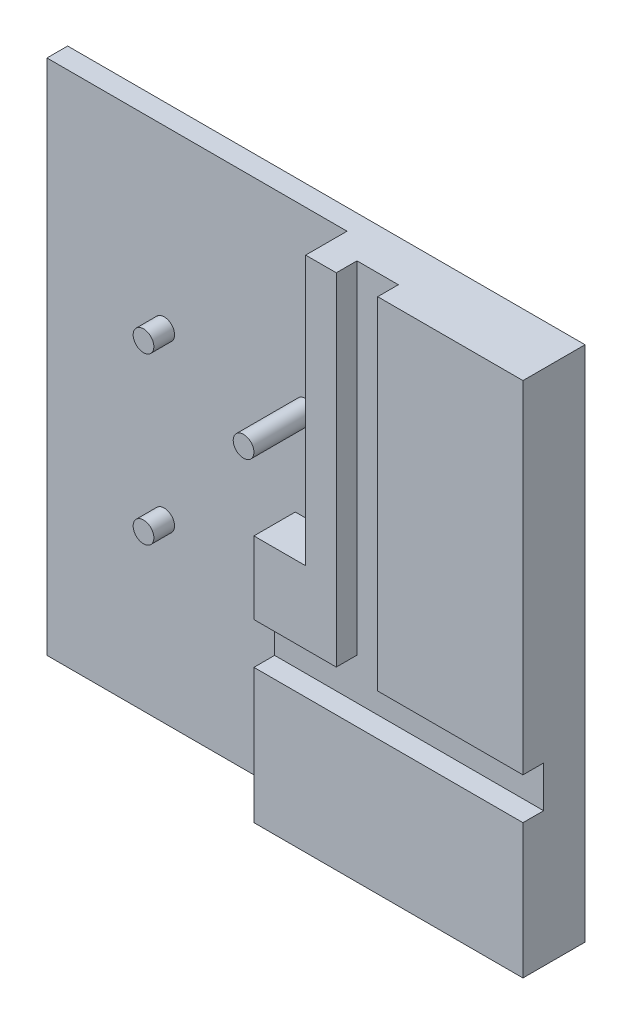
ISO-10303-21;
HEADER;
FILE_DESCRIPTION(('STEP AP214'),'2;1');
FILE_NAME('part.step','',(''),(''),'','','');
FILE_SCHEMA(('AUTOMOTIVE_DESIGN { 1 0 10303 214 1 1 1 1 }'));
ENDSEC;
DATA;
#1=APPLICATION_CONTEXT('core data for automotive mechanical design processes');
#2=APPLICATION_PROTOCOL_DEFINITION('international standard','automotive_design',2000,#1);
#3=PRODUCT_CONTEXT('',#1,'mechanical');
#4=PRODUCT('Part','Part','',(#3));
#5=PRODUCT_RELATED_PRODUCT_CATEGORY('part','',(#4));
#6=PRODUCT_DEFINITION_FORMATION('','',#4);
#7=PRODUCT_DEFINITION_CONTEXT('part definition',#1,'design');
#8=PRODUCT_DEFINITION('design','',#6,#7);
#9=PRODUCT_DEFINITION_SHAPE('','',#8);
#10=(LENGTH_UNIT() NAMED_UNIT(*) SI_UNIT(.MILLI.,.METRE.));
#11=(NAMED_UNIT(*) PLANE_ANGLE_UNIT() SI_UNIT($,.RADIAN.));
#12=(NAMED_UNIT(*) SI_UNIT($,.STERADIAN.) SOLID_ANGLE_UNIT());
#13=UNCERTAINTY_MEASURE_WITH_UNIT(LENGTH_MEASURE(1.E-05),#10,'distance_accuracy_value','');
#14=(GEOMETRIC_REPRESENTATION_CONTEXT(3) GLOBAL_UNCERTAINTY_ASSIGNED_CONTEXT((#13)) GLOBAL_UNIT_ASSIGNED_CONTEXT((#10,
#11,#12)) REPRESENTATION_CONTEXT('',''));
#15=CARTESIAN_POINT('',(0.,0.,0.));
#16=DIRECTION('',(0.,0.,1.));
#17=DIRECTION('',(1.,0.,0.));
#18=AXIS2_PLACEMENT_3D('',#15,#16,#17);
#19=CARTESIAN_POINT('',(0.,0.,20.));
#20=DIRECTION('',(0.,0.,-1.));
#21=DIRECTION('',(-1.,0.,0.));
#22=AXIS2_PLACEMENT_3D('',#19,#20,#21);
#23=PLANE('',#22);
#24=DIRECTION('',(-1.,0.,0.));
#25=VECTOR('',#24,1.);
#26=CARTESIAN_POINT('',(25.,-60.,20.));
#27=LINE('',#26,#25);
#28=CARTESIAN_POINT('',(125.,-60.,20.));
#29=VERTEX_POINT('',#28);
#30=CARTESIAN_POINT('',(-4.99999999999999,-60.,20.));
#31=VERTEX_POINT('',#30);
#32=EDGE_CURVE('E221',#29,#31,#27,.T.);
#33=ORIENTED_EDGE('',*,*,#32,.T.);
#34=DIRECTION('',(0.,-1.,0.));
#35=VECTOR('',#34,1.);
#36=CARTESIAN_POINT('',(-4.99999999999999,-125.,20.));
#37=LINE('',#36,#35);
#38=CARTESIAN_POINT('',(-4.99999999999999,-125.,20.));
#39=VERTEX_POINT('',#38);
#40=EDGE_CURVE('E166',#31,#39,#37,.T.);
#41=ORIENTED_EDGE('',*,*,#40,.T.);
#42=DIRECTION('',(1.,0.,0.));
#43=VECTOR('',#42,1.);
#44=CARTESIAN_POINT('',(25.,-125.,20.));
#45=LINE('',#44,#43);
#46=CARTESIAN_POINT('',(125.,-125.,20.));
#47=VERTEX_POINT('',#46);
#48=EDGE_CURVE('E216',#39,#47,#45,.T.);
#49=ORIENTED_EDGE('',*,*,#48,.T.);
#50=DIRECTION('',(0.,1.,0.));
#51=VECTOR('',#50,1.);
#52=CARTESIAN_POINT('',(125.,-60.,20.));
#53=LINE('',#52,#51);
#54=EDGE_CURVE('E219',#47,#29,#53,.T.);
#55=ORIENTED_EDGE('',*,*,#54,.T.);
#56=EDGE_LOOP('',(#33,#41,#49,#55));
#57=FACE_BOUND('',#56,.T.);
#58=ADVANCED_FACE('F36',(#57),#23,.F.);
#59=CARTESIAN_POINT('',(0.,0.,0.));
#60=DIRECTION('',(0.,0.,1.));
#61=DIRECTION('',(1.,0.,0.));
#62=AXIS2_PLACEMENT_3D('',#59,#60,#61);
#63=PLANE('',#62);
#64=CARTESIAN_POINT('',(0.,40.,0.));
#65=DIRECTION('',(0.,0.,1.));
#66=DIRECTION('',(1.,0.,0.));
#67=AXIS2_PLACEMENT_3D('',#64,#65,#66);
#68=CIRCLE('',#67,5.);
#69=CARTESIAN_POINT('',(5.,40.,0.));
#70=VERTEX_POINT('',#69);
#71=EDGE_CURVE('E245',#70,#70,#68,.T.);
#72=ORIENTED_EDGE('',*,*,#71,.F.);
#73=EDGE_LOOP('',(#72));
#74=FACE_BOUND('',#73,.T.);
#75=CARTESIAN_POINT('',(-68.35,-40.,0.));
#76=DIRECTION('',(0.,0.,1.));
#77=DIRECTION('',(1.,0.,0.));
#78=AXIS2_PLACEMENT_3D('',#75,#76,#77);
#79=CIRCLE('',#78,5.00000000000001);
#80=CARTESIAN_POINT('',(-63.35,-40.,0.));
#81=VERTEX_POINT('',#80);
#82=EDGE_CURVE('E44',#81,#81,#79,.T.);
#83=ORIENTED_EDGE('',*,*,#82,.F.);
#84=EDGE_LOOP('',(#83));
#85=FACE_BOUND('',#84,.T.);
#86=CARTESIAN_POINT('',(-68.35,40.,0.));
#87=DIRECTION('',(0.,0.,1.));
#88=DIRECTION('',(1.,0.,0.));
#89=AXIS2_PLACEMENT_3D('',#86,#87,#88);
#90=CIRCLE('',#89,5.00000000000001);
#91=CARTESIAN_POINT('',(-63.35,40.,0.));
#92=VERTEX_POINT('',#91);
#93=EDGE_CURVE('E254',#92,#92,#90,.T.);
#94=ORIENTED_EDGE('',*,*,#93,.F.);
#95=EDGE_LOOP('',(#94));
#96=FACE_BOUND('',#95,.T.);
#97=DIRECTION('',(0.,-1.,0.));
#98=VECTOR('',#97,1.);
#99=CARTESIAN_POINT('',(-4.99999999999999,-125.,0.));
#100=LINE('',#99,#98);
#101=CARTESIAN_POINT('',(-4.99999999999999,-5.,0.));
#102=VERTEX_POINT('',#101);
#103=CARTESIAN_POINT('',(-4.99999999999999,-125.,0.));
#104=VERTEX_POINT('',#103);
#105=EDGE_CURVE('E169',#102,#104,#100,.T.);
#106=ORIENTED_EDGE('',*,*,#105,.F.);
#107=DIRECTION('',(-1.,0.,0.));
#108=VECTOR('',#107,1.);
#109=CARTESIAN_POINT('',(25.,-5.,0.));
#110=LINE('',#109,#108);
#111=CARTESIAN_POINT('',(20.,-5.,0.));
#112=VERTEX_POINT('',#111);
#113=EDGE_CURVE('E167',#112,#102,#110,.T.);
#114=ORIENTED_EDGE('',*,*,#113,.F.);
#115=DIRECTION('',(0.,-1.,0.));
#116=VECTOR('',#115,1.);
#117=CARTESIAN_POINT('',(20.,125.,0.));
#118=LINE('',#117,#116);
#119=CARTESIAN_POINT('',(20.,125.,0.));
#120=VERTEX_POINT('',#119);
#121=EDGE_CURVE('E224',#120,#112,#118,.T.);
#122=ORIENTED_EDGE('',*,*,#121,.F.);
#123=DIRECTION('',(-1.,0.,0.));
#124=VECTOR('',#123,1.);
#125=CARTESIAN_POINT('',(-125.,125.,0.));
#126=LINE('',#125,#124);
#127=CARTESIAN_POINT('',(-125.,125.,0.));
#128=VERTEX_POINT('',#127);
#129=EDGE_CURVE('E258',#120,#128,#126,.T.);
#130=ORIENTED_EDGE('',*,*,#129,.T.);
#131=DIRECTION('',(0.,-1.,0.));
#132=VECTOR('',#131,1.);
#133=CARTESIAN_POINT('',(-125.,125.,0.));
#134=LINE('',#133,#132);
#135=CARTESIAN_POINT('',(-125.,-125.,0.));
#136=VERTEX_POINT('',#135);
#137=EDGE_CURVE('E276',#128,#136,#134,.T.);
#138=ORIENTED_EDGE('',*,*,#137,.T.);
#139=DIRECTION('',(1.,0.,0.));
#140=VECTOR('',#139,1.);
#141=CARTESIAN_POINT('',(-125.,-125.,0.));
#142=LINE('',#141,#140);
#143=EDGE_CURVE('E265',#136,#104,#142,.T.);
#144=ORIENTED_EDGE('',*,*,#143,.T.);
#145=EDGE_LOOP('',(#106,#114,#122,#130,#138,#144));
#146=FACE_BOUND('',#145,.T.);
#147=ADVANCED_FACE('F293',(#74,#85,#96,#146),#63,.T.);
#148=CARTESIAN_POINT('',(34.8,-40.,20.));
#149=DIRECTION('',(0.,1.,0.));
#150=DIRECTION('',(0.,0.,1.));
#151=AXIS2_PLACEMENT_3D('',#148,#149,#150);
#152=PLANE('',#151);
#153=DIRECTION('',(1.,0.,0.));
#154=VECTOR('',#153,1.);
#155=CARTESIAN_POINT('',(34.8,-40.,20.));
#156=LINE('',#155,#154);
#157=CARTESIAN_POINT('',(-4.99999999999999,-40.,20.));
#158=VERTEX_POINT('',#157);
#159=CARTESIAN_POINT('',(34.8,-40.,20.));
#160=VERTEX_POINT('',#159);
#161=EDGE_CURVE('E233',#158,#160,#156,.T.);
#162=ORIENTED_EDGE('',*,*,#161,.F.);
#163=DIRECTION('',(0.,0.,1.));
#164=VECTOR('',#163,1.);
#165=CARTESIAN_POINT('',(-4.99999999999999,-40.,10.));
#166=LINE('',#165,#164);
#167=CARTESIAN_POINT('',(-4.99999999999999,-40.,10.));
#168=VERTEX_POINT('',#167);
#169=EDGE_CURVE('E162',#168,#158,#166,.T.);
#170=ORIENTED_EDGE('',*,*,#169,.F.);
#171=DIRECTION('',(-1.,0.,0.));
#172=VECTOR('',#171,1.);
#173=CARTESIAN_POINT('',(34.8,-40.,10.));
#174=LINE('',#173,#172);
#175=CARTESIAN_POINT('',(34.8,-40.,10.));
#176=VERTEX_POINT('',#175);
#177=EDGE_CURVE('E51',#176,#168,#174,.T.);
#178=ORIENTED_EDGE('',*,*,#177,.F.);
#179=DIRECTION('',(0.,0.,-1.));
#180=VECTOR('',#179,1.);
#181=CARTESIAN_POINT('',(34.8,-40.,20.));
#182=LINE('',#181,#180);
#183=EDGE_CURVE('E235',#160,#176,#182,.T.);
#184=ORIENTED_EDGE('',*,*,#183,.F.);
#185=EDGE_LOOP('',(#162,#170,#178,#184));
#186=FACE_BOUND('',#185,.T.);
#187=ADVANCED_FACE('F296',(#186),#152,.F.);
#188=CARTESIAN_POINT('',(20.,125.,20.));
#189=DIRECTION('',(1.,0.,0.));
#190=DIRECTION('',(0.,1.,0.));
#191=AXIS2_PLACEMENT_3D('',#188,#189,#190);
#192=PLANE('',#191);
#193=DIRECTION('',(0.,0.,-1.));
#194=VECTOR('',#193,1.);
#195=CARTESIAN_POINT('',(20.,-5.,20.));
#196=LINE('',#195,#194);
#197=CARTESIAN_POINT('',(20.,-5.,20.));
#198=VERTEX_POINT('',#197);
#199=EDGE_CURVE('E185',#198,#112,#196,.T.);
#200=ORIENTED_EDGE('',*,*,#199,.F.);
#201=DIRECTION('',(0.,-1.,0.));
#202=VECTOR('',#201,1.);
#203=CARTESIAN_POINT('',(20.,125.,20.));
#204=LINE('',#203,#202);
#205=CARTESIAN_POINT('',(20.,125.,20.));
#206=VERTEX_POINT('',#205);
#207=EDGE_CURVE('E230',#206,#198,#204,.T.);
#208=ORIENTED_EDGE('',*,*,#207,.F.);
#209=DIRECTION('',(0.,0.,-1.));
#210=VECTOR('',#209,1.);
#211=CARTESIAN_POINT('',(20.,125.,20.));
#212=LINE('',#211,#210);
#213=EDGE_CURVE('E240',#206,#120,#212,.T.);
#214=ORIENTED_EDGE('',*,*,#213,.T.);
#215=ORIENTED_EDGE('',*,*,#121,.T.);
#216=EDGE_LOOP('',(#200,#208,#214,#215));
#217=FACE_BOUND('',#216,.T.);
#218=ADVANCED_FACE('F338',(#217),#192,.F.);
#219=CARTESIAN_POINT('',(0.,0.,10.));
#220=DIRECTION('',(0.,0.,-1.));
#221=DIRECTION('',(-1.,0.,0.));
#222=AXIS2_PLACEMENT_3D('',#219,#220,#221);
#223=PLANE('',#222);
#224=DIRECTION('',(0.,-1.,0.));
#225=VECTOR('',#224,1.);
#226=CARTESIAN_POINT('',(54.8,125.,10.));
#227=LINE('',#226,#225);
#228=CARTESIAN_POINT('',(54.8,125.,10.));
#229=VERTEX_POINT('',#228);
#230=CARTESIAN_POINT('',(54.8,-40.,10.));
#231=VERTEX_POINT('',#230);
#232=EDGE_CURVE('E187',#229,#231,#227,.T.);
#233=ORIENTED_EDGE('',*,*,#232,.F.);
#234=DIRECTION('',(-1.,0.,0.));
#235=VECTOR('',#234,1.);
#236=CARTESIAN_POINT('',(25.,125.,10.));
#237=LINE('',#236,#235);
#238=CARTESIAN_POINT('',(34.8,125.,10.));
#239=VERTEX_POINT('',#238);
#240=EDGE_CURVE('E211',#229,#239,#237,.T.);
#241=ORIENTED_EDGE('',*,*,#240,.T.);
#242=DIRECTION('',(0.,-1.,0.));
#243=VECTOR('',#242,1.);
#244=CARTESIAN_POINT('',(34.8,125.,10.));
#245=LINE('',#244,#243);
#246=EDGE_CURVE('E214',#239,#176,#245,.T.);
#247=ORIENTED_EDGE('',*,*,#246,.T.);
#248=ORIENTED_EDGE('',*,*,#177,.T.);
#249=DIRECTION('',(0.,-1.,0.));
#250=VECTOR('',#249,1.);
#251=CARTESIAN_POINT('',(-4.99999999999999,-60.,10.));
#252=LINE('',#251,#250);
#253=CARTESIAN_POINT('',(-4.99999999999999,-60.,10.));
#254=VERTEX_POINT('',#253);
#255=EDGE_CURVE('E158',#168,#254,#252,.T.);
#256=ORIENTED_EDGE('',*,*,#255,.T.);
#257=DIRECTION('',(1.,0.,0.));
#258=VECTOR('',#257,1.);
#259=CARTESIAN_POINT('',(25.,-60.,10.));
#260=LINE('',#259,#258);
#261=CARTESIAN_POINT('',(125.,-60.,10.));
#262=VERTEX_POINT('',#261);
#263=EDGE_CURVE('E11',#254,#262,#260,.T.);
#264=ORIENTED_EDGE('',*,*,#263,.T.);
#265=DIRECTION('',(0.,1.,0.));
#266=VECTOR('',#265,1.);
#267=CARTESIAN_POINT('',(125.,-125.,10.));
#268=LINE('',#267,#266);
#269=CARTESIAN_POINT('',(125.,-40.,10.));
#270=VERTEX_POINT('',#269);
#271=EDGE_CURVE('E209',#262,#270,#268,.T.);
#272=ORIENTED_EDGE('',*,*,#271,.T.);
#273=DIRECTION('',(1.,0.,0.));
#274=VECTOR('',#273,1.);
#275=CARTESIAN_POINT('',(54.8,-40.,10.));
#276=LINE('',#275,#274);
#277=EDGE_CURVE('E58',#231,#270,#276,.T.);
#278=ORIENTED_EDGE('',*,*,#277,.F.);
#279=EDGE_LOOP('',(#233,#241,#247,#248,#256,#264,#272,#278));
#280=FACE_BOUND('',#279,.T.);
#281=ADVANCED_FACE('F159',(#280),#223,.F.);
#282=CARTESIAN_POINT('',(34.8,125.,20.));
#283=DIRECTION('',(-1.,0.,0.));
#284=DIRECTION('',(0.,-1.,0.));
#285=AXIS2_PLACEMENT_3D('',#282,#283,#284);
#286=PLANE('',#285);
#287=ORIENTED_EDGE('',*,*,#246,.F.);
#288=DIRECTION('',(0.,0.,-1.));
#289=VECTOR('',#288,1.);
#290=CARTESIAN_POINT('',(34.8,125.,20.));
#291=LINE('',#290,#289);
#292=CARTESIAN_POINT('',(34.8,125.,20.));
#293=VERTEX_POINT('',#292);
#294=EDGE_CURVE('E242',#293,#239,#291,.T.);
#295=ORIENTED_EDGE('',*,*,#294,.F.);
#296=DIRECTION('',(0.,1.,0.));
#297=VECTOR('',#296,1.);
#298=CARTESIAN_POINT('',(34.8,125.,20.));
#299=LINE('',#298,#297);
#300=EDGE_CURVE('E225',#160,#293,#299,.T.);
#301=ORIENTED_EDGE('',*,*,#300,.F.);
#302=ORIENTED_EDGE('',*,*,#183,.T.);
#303=EDGE_LOOP('',(#287,#295,#301,#302));
#304=FACE_BOUND('',#303,.T.);
#305=ADVANCED_FACE('F327',(#304),#286,.F.);
#306=CARTESIAN_POINT('',(25.,-60.,20.));
#307=DIRECTION('',(0.,-1.,0.));
#308=DIRECTION('',(0.,0.,-1.));
#309=AXIS2_PLACEMENT_3D('',#306,#307,#308);
#310=PLANE('',#309);
#311=ORIENTED_EDGE('',*,*,#263,.F.);
#312=DIRECTION('',(0.,0.,1.));
#313=VECTOR('',#312,1.);
#314=CARTESIAN_POINT('',(-4.99999999999999,-60.,10.));
#315=LINE('',#314,#313);
#316=EDGE_CURVE('E152',#254,#31,#315,.T.);
#317=ORIENTED_EDGE('',*,*,#316,.T.);
#318=ORIENTED_EDGE('',*,*,#32,.F.);
#319=DIRECTION('',(0.,0.,-1.));
#320=VECTOR('',#319,1.);
#321=CARTESIAN_POINT('',(125.,-60.,20.));
#322=LINE('',#321,#320);
#323=EDGE_CURVE('E155',#29,#262,#322,.T.);
#324=ORIENTED_EDGE('',*,*,#323,.T.);
#325=EDGE_LOOP('',(#311,#317,#318,#324));
#326=FACE_BOUND('',#325,.T.);
#327=ADVANCED_FACE('F149',(#326),#310,.F.);
#328=CARTESIAN_POINT('',(125.,125.,-10.));
#329=DIRECTION('',(1.,0.,0.));
#330=DIRECTION('',(0.,0.,-1.));
#331=AXIS2_PLACEMENT_3D('',#328,#329,#330);
#332=PLANE('',#331);
#333=ORIENTED_EDGE('',*,*,#54,.F.);
#334=DIRECTION('',(0.,0.,1.));
#335=VECTOR('',#334,1.);
#336=CARTESIAN_POINT('',(125.,-125.,-10.));
#337=LINE('',#336,#335);
#338=CARTESIAN_POINT('',(125.,-125.,-10.));
#339=VERTEX_POINT('',#338);
#340=EDGE_CURVE('E281',#339,#47,#337,.T.);
#341=ORIENTED_EDGE('',*,*,#340,.F.);
#342=DIRECTION('',(0.,1.,0.));
#343=VECTOR('',#342,1.);
#344=CARTESIAN_POINT('',(125.,125.,-10.));
#345=LINE('',#344,#343);
#346=CARTESIAN_POINT('',(125.,125.,-10.));
#347=VERTEX_POINT('',#346);
#348=EDGE_CURVE('E261',#339,#347,#345,.T.);
#349=ORIENTED_EDGE('',*,*,#348,.T.);
#350=DIRECTION('',(0.,0.,1.));
#351=VECTOR('',#350,1.);
#352=CARTESIAN_POINT('',(125.,125.,-10.));
#353=LINE('',#352,#351);
#354=CARTESIAN_POINT('',(125.,125.,20.));
#355=VERTEX_POINT('',#354);
#356=EDGE_CURVE('E274',#347,#355,#353,.T.);
#357=ORIENTED_EDGE('',*,*,#356,.T.);
#358=DIRECTION('',(0.,1.,0.));
#359=VECTOR('',#358,1.);
#360=CARTESIAN_POINT('',(125.,125.,20.));
#361=LINE('',#360,#359);
#362=CARTESIAN_POINT('',(125.,-40.,20.));
#363=VERTEX_POINT('',#362);
#364=EDGE_CURVE('E193',#363,#355,#361,.T.);
#365=ORIENTED_EDGE('',*,*,#364,.F.);
#366=DIRECTION('',(0.,0.,-1.));
#367=VECTOR('',#366,1.);
#368=CARTESIAN_POINT('',(125.,-40.,20.));
#369=LINE('',#368,#367);
#370=EDGE_CURVE('E204',#363,#270,#369,.T.);
#371=ORIENTED_EDGE('',*,*,#370,.T.);
#372=ORIENTED_EDGE('',*,*,#271,.F.);
#373=ORIENTED_EDGE('',*,*,#323,.F.);
#374=EDGE_LOOP('',(#333,#341,#349,#357,#365,#371,#372,#373));
#375=FACE_BOUND('',#374,.T.);
#376=ADVANCED_FACE('F38',(#375),#332,.T.);
#377=CARTESIAN_POINT('',(-125.,-125.,-10.));
#378=DIRECTION('',(0.,-1.,0.));
#379=DIRECTION('',(0.,0.,-1.));
#380=AXIS2_PLACEMENT_3D('',#377,#378,#379);
#381=PLANE('',#380);
#382=ORIENTED_EDGE('',*,*,#340,.T.);
#383=ORIENTED_EDGE('',*,*,#48,.F.);
#384=DIRECTION('',(0.,0.,-1.));
#385=VECTOR('',#384,1.);
#386=CARTESIAN_POINT('',(-4.99999999999999,-125.,20.));
#387=LINE('',#386,#385);
#388=EDGE_CURVE('E177',#39,#104,#387,.T.);
#389=ORIENTED_EDGE('',*,*,#388,.T.);
#390=ORIENTED_EDGE('',*,*,#143,.F.);
#391=DIRECTION('',(0.,0.,1.));
#392=VECTOR('',#391,1.);
#393=CARTESIAN_POINT('',(-125.,-125.,-10.));
#394=LINE('',#393,#392);
#395=CARTESIAN_POINT('',(-125.,-125.,-10.));
#396=VERTEX_POINT('',#395);
#397=EDGE_CURVE('E283',#396,#136,#394,.T.);
#398=ORIENTED_EDGE('',*,*,#397,.F.);
#399=DIRECTION('',(1.,0.,0.));
#400=VECTOR('',#399,1.);
#401=CARTESIAN_POINT('',(-125.,-125.,-10.));
#402=LINE('',#401,#400);
#403=EDGE_CURVE('E271',#396,#339,#402,.T.);
#404=ORIENTED_EDGE('',*,*,#403,.T.);
#405=EDGE_LOOP('',(#382,#383,#389,#390,#398,#404));
#406=FACE_BOUND('',#405,.T.);
#407=ADVANCED_FACE('F309',(#406),#381,.T.);
#408=CARTESIAN_POINT('',(-125.,125.,-10.));
#409=DIRECTION('',(-1.,0.,0.));
#410=DIRECTION('',(0.,0.,1.));
#411=AXIS2_PLACEMENT_3D('',#408,#409,#410);
#412=PLANE('',#411);
#413=ORIENTED_EDGE('',*,*,#137,.F.);
#414=DIRECTION('',(0.,0.,1.));
#415=VECTOR('',#414,1.);
#416=CARTESIAN_POINT('',(-125.,125.,-10.));
#417=LINE('',#416,#415);
#418=CARTESIAN_POINT('',(-125.,125.,-10.));
#419=VERTEX_POINT('',#418);
#420=EDGE_CURVE('E285',#419,#128,#417,.T.);
#421=ORIENTED_EDGE('',*,*,#420,.F.);
#422=DIRECTION('',(0.,-1.,0.));
#423=VECTOR('',#422,1.);
#424=CARTESIAN_POINT('',(-125.,125.,-10.));
#425=LINE('',#424,#423);
#426=EDGE_CURVE('E268',#419,#396,#425,.T.);
#427=ORIENTED_EDGE('',*,*,#426,.T.);
#428=ORIENTED_EDGE('',*,*,#397,.T.);
#429=EDGE_LOOP('',(#413,#421,#427,#428));
#430=FACE_BOUND('',#429,.T.);
#431=ADVANCED_FACE('F388',(#430),#412,.T.);
#432=CARTESIAN_POINT('',(-125.,125.,-10.));
#433=DIRECTION('',(0.,1.,0.));
#434=DIRECTION('',(0.,0.,1.));
#435=AXIS2_PLACEMENT_3D('',#432,#433,#434);
#436=PLANE('',#435);
#437=ORIENTED_EDGE('',*,*,#294,.T.);
#438=ORIENTED_EDGE('',*,*,#240,.F.);
#439=DIRECTION('',(0.,0.,-1.));
#440=VECTOR('',#439,1.);
#441=CARTESIAN_POINT('',(54.8,125.,20.));
#442=LINE('',#441,#440);
#443=CARTESIAN_POINT('',(54.8,125.,20.));
#444=VERTEX_POINT('',#443);
#445=EDGE_CURVE('E198',#444,#229,#442,.T.);
#446=ORIENTED_EDGE('',*,*,#445,.F.);
#447=DIRECTION('',(-1.,0.,0.));
#448=VECTOR('',#447,1.);
#449=CARTESIAN_POINT('',(54.8,125.,20.));
#450=LINE('',#449,#448);
#451=EDGE_CURVE('E196',#355,#444,#450,.T.);
#452=ORIENTED_EDGE('',*,*,#451,.F.);
#453=ORIENTED_EDGE('',*,*,#356,.F.);
#454=DIRECTION('',(-1.,0.,0.));
#455=VECTOR('',#454,1.);
#456=CARTESIAN_POINT('',(-125.,125.,-10.));
#457=LINE('',#456,#455);
#458=EDGE_CURVE('E264',#347,#419,#457,.T.);
#459=ORIENTED_EDGE('',*,*,#458,.T.);
#460=ORIENTED_EDGE('',*,*,#420,.T.);
#461=ORIENTED_EDGE('',*,*,#129,.F.);
#462=ORIENTED_EDGE('',*,*,#213,.F.);
#463=DIRECTION('',(-1.,0.,0.));
#464=VECTOR('',#463,1.);
#465=CARTESIAN_POINT('',(34.8,125.,20.));
#466=LINE('',#465,#464);
#467=EDGE_CURVE('E228',#293,#206,#466,.T.);
#468=ORIENTED_EDGE('',*,*,#467,.F.);
#469=EDGE_LOOP('',(#437,#438,#446,#452,#453,#459,#460,#461,#462,#468));
#470=FACE_BOUND('',#469,.T.);
#471=ADVANCED_FACE('F330',(#470),#436,.T.);
#472=CARTESIAN_POINT('',(0.,0.,-10.));
#473=DIRECTION('',(0.,0.,1.));
#474=DIRECTION('',(1.,0.,0.));
#475=AXIS2_PLACEMENT_3D('',#472,#473,#474);
#476=PLANE('',#475);
#477=ORIENTED_EDGE('',*,*,#348,.F.);
#478=ORIENTED_EDGE('',*,*,#403,.F.);
#479=ORIENTED_EDGE('',*,*,#426,.F.);
#480=ORIENTED_EDGE('',*,*,#458,.F.);
#481=EDGE_LOOP('',(#477,#478,#479,#480));
#482=FACE_BOUND('',#481,.T.);
#483=ADVANCED_FACE('F381',(#482),#476,.F.);
#484=CARTESIAN_POINT('',(-68.35,40.,10.));
#485=DIRECTION('',(0.,0.,-1.));
#486=DIRECTION('',(-1.,0.,0.));
#487=AXIS2_PLACEMENT_3D('',#484,#485,#486);
#488=CYLINDRICAL_SURFACE('',#487,5.00000000000001);
#489=CARTESIAN_POINT('',(-68.35,40.,10.));
#490=DIRECTION('',(0.,0.,1.));
#491=DIRECTION('',(1.,0.,0.));
#492=AXIS2_PLACEMENT_3D('',#489,#490,#491);
#493=CIRCLE('',#492,5.00000000000001);
#494=CARTESIAN_POINT('',(-63.35,40.,10.));
#495=VERTEX_POINT('',#494);
#496=EDGE_CURVE('E255',#495,#495,#493,.T.);
#497=ORIENTED_EDGE('',*,*,#496,.F.);
#498=EDGE_LOOP('',(#497));
#499=FACE_BOUND('',#498,.T.);
#500=ORIENTED_EDGE('',*,*,#93,.T.);
#501=EDGE_LOOP('',(#500));
#502=FACE_BOUND('',#501,.T.);
#503=ADVANCED_FACE('F377',(#499,#502),#488,.T.);
#504=CARTESIAN_POINT('',(-68.35,40.,10.));
#505=DIRECTION('',(0.,0.,1.));
#506=DIRECTION('',(1.,0.,0.));
#507=AXIS2_PLACEMENT_3D('',#504,#505,#506);
#508=PLANE('',#507);
#509=ORIENTED_EDGE('',*,*,#496,.T.);
#510=EDGE_LOOP('',(#509));
#511=FACE_BOUND('',#510,.T.);
#512=ADVANCED_FACE('F373',(#511),#508,.T.);
#513=CARTESIAN_POINT('',(-68.35,-40.,10.));
#514=DIRECTION('',(0.,0.,-1.));
#515=DIRECTION('',(-1.,0.,0.));
#516=AXIS2_PLACEMENT_3D('',#513,#514,#515);
#517=CYLINDRICAL_SURFACE('',#516,5.00000000000001);
#518=CARTESIAN_POINT('',(-68.35,-40.,10.));
#519=DIRECTION('',(0.,0.,-1.));
#520=DIRECTION('',(1.,0.,0.));
#521=AXIS2_PLACEMENT_3D('',#518,#519,#520);
#522=CIRCLE('',#521,5.00000000000001);
#523=CARTESIAN_POINT('',(-63.35,-40.,10.));
#524=VERTEX_POINT('',#523);
#525=EDGE_CURVE('E249',#524,#524,#522,.T.);
#526=ORIENTED_EDGE('',*,*,#525,.T.);
#527=EDGE_LOOP('',(#526));
#528=FACE_BOUND('',#527,.T.);
#529=ORIENTED_EDGE('',*,*,#82,.T.);
#530=EDGE_LOOP('',(#529));
#531=FACE_BOUND('',#530,.T.);
#532=ADVANCED_FACE('F291',(#528,#531),#517,.T.);
#533=CARTESIAN_POINT('',(-68.35,-40.,10.));
#534=DIRECTION('',(0.,0.,1.));
#535=DIRECTION('',(1.,0.,0.));
#536=AXIS2_PLACEMENT_3D('',#533,#534,#535);
#537=PLANE('',#536);
#538=ORIENTED_EDGE('',*,*,#525,.F.);
#539=EDGE_LOOP('',(#538));
#540=FACE_BOUND('',#539,.T.);
#541=ADVANCED_FACE('F363',(#540),#537,.T.);
#542=CARTESIAN_POINT('',(0.,40.,30.));
#543=DIRECTION('',(0.,0.,-1.));
#544=DIRECTION('',(-1.,0.,0.));
#545=AXIS2_PLACEMENT_3D('',#542,#543,#544);
#546=CYLINDRICAL_SURFACE('',#545,5.);
#547=CARTESIAN_POINT('',(0.,40.,30.));
#548=DIRECTION('',(0.,0.,1.));
#549=DIRECTION('',(1.,0.,0.));
#550=AXIS2_PLACEMENT_3D('',#547,#548,#549);
#551=CIRCLE('',#550,5.);
#552=CARTESIAN_POINT('',(5.,40.,30.));
#553=VERTEX_POINT('',#552);
#554=EDGE_CURVE('E246',#553,#553,#551,.T.);
#555=ORIENTED_EDGE('',*,*,#554,.F.);
#556=EDGE_LOOP('',(#555));
#557=FACE_BOUND('',#556,.T.);
#558=ORIENTED_EDGE('',*,*,#71,.T.);
#559=EDGE_LOOP('',(#558));
#560=FACE_BOUND('',#559,.T.);
#561=ADVANCED_FACE('F357',(#557,#560),#546,.T.);
#562=CARTESIAN_POINT('',(0.,40.,30.));
#563=DIRECTION('',(0.,0.,1.));
#564=DIRECTION('',(1.,0.,0.));
#565=AXIS2_PLACEMENT_3D('',#562,#563,#564);
#566=PLANE('',#565);
#567=ORIENTED_EDGE('',*,*,#554,.T.);
#568=EDGE_LOOP('',(#567));
#569=FACE_BOUND('',#568,.T.);
#570=ADVANCED_FACE('F351',(#569),#566,.T.);
#571=CARTESIAN_POINT('',(-4.99999999999999,-5.,20.));
#572=VERTEX_POINT('',#571);
#573=EDGE_CURVE('E175',#572,#158,#37,.T.);
#574=ORIENTED_EDGE('',*,*,#573,.T.);
#575=ORIENTED_EDGE('',*,*,#161,.T.);
#576=ORIENTED_EDGE('',*,*,#300,.T.);
#577=ORIENTED_EDGE('',*,*,#467,.T.);
#578=ORIENTED_EDGE('',*,*,#207,.T.);
#579=DIRECTION('',(-1.,0.,0.));
#580=VECTOR('',#579,1.);
#581=CARTESIAN_POINT('',(25.,-5.,20.));
#582=LINE('',#581,#580);
#583=EDGE_CURVE('E173',#198,#572,#582,.T.);
#584=ORIENTED_EDGE('',*,*,#583,.T.);
#585=EDGE_LOOP('',(#574,#575,#576,#577,#578,#584));
#586=FACE_BOUND('',#585,.T.);
#587=ADVANCED_FACE('F335',(#586),#23,.F.);
#588=CARTESIAN_POINT('',(54.8,125.,20.));
#589=DIRECTION('',(1.,0.,0.));
#590=DIRECTION('',(0.,1.,0.));
#591=AXIS2_PLACEMENT_3D('',#588,#589,#590);
#592=PLANE('',#591);
#593=ORIENTED_EDGE('',*,*,#232,.T.);
#594=DIRECTION('',(0.,0.,-1.));
#595=VECTOR('',#594,1.);
#596=CARTESIAN_POINT('',(54.8,-40.,20.));
#597=LINE('',#596,#595);
#598=CARTESIAN_POINT('',(54.8,-40.,20.));
#599=VERTEX_POINT('',#598);
#600=EDGE_CURVE('E207',#599,#231,#597,.T.);
#601=ORIENTED_EDGE('',*,*,#600,.F.);
#602=DIRECTION('',(0.,-1.,0.));
#603=VECTOR('',#602,1.);
#604=CARTESIAN_POINT('',(54.8,125.,20.));
#605=LINE('',#604,#603);
#606=EDGE_CURVE('E188',#444,#599,#605,.T.);
#607=ORIENTED_EDGE('',*,*,#606,.F.);
#608=ORIENTED_EDGE('',*,*,#445,.T.);
#609=EDGE_LOOP('',(#593,#601,#607,#608));
#610=FACE_BOUND('',#609,.T.);
#611=ADVANCED_FACE('F321',(#610),#592,.F.);
#612=CARTESIAN_POINT('',(54.8,-40.,20.));
#613=DIRECTION('',(0.,1.,0.));
#614=DIRECTION('',(0.,0.,1.));
#615=AXIS2_PLACEMENT_3D('',#612,#613,#614);
#616=PLANE('',#615);
#617=ORIENTED_EDGE('',*,*,#277,.T.);
#618=ORIENTED_EDGE('',*,*,#370,.F.);
#619=DIRECTION('',(1.,0.,0.));
#620=VECTOR('',#619,1.);
#621=CARTESIAN_POINT('',(54.8,-40.,20.));
#622=LINE('',#621,#620);
#623=EDGE_CURVE('E191',#599,#363,#622,.T.);
#624=ORIENTED_EDGE('',*,*,#623,.F.);
#625=ORIENTED_EDGE('',*,*,#600,.T.);
#626=EDGE_LOOP('',(#617,#618,#624,#625));
#627=FACE_BOUND('',#626,.T.);
#628=ADVANCED_FACE('F317',(#627),#616,.F.);
#629=CARTESIAN_POINT('',(0.,0.,20.));
#630=DIRECTION('',(0.,0.,1.));
#631=DIRECTION('',(1.,0.,0.));
#632=AXIS2_PLACEMENT_3D('',#629,#630,#631);
#633=PLANE('',#632);
#634=ORIENTED_EDGE('',*,*,#606,.T.);
#635=ORIENTED_EDGE('',*,*,#623,.T.);
#636=ORIENTED_EDGE('',*,*,#364,.T.);
#637=ORIENTED_EDGE('',*,*,#451,.T.);
#638=EDGE_LOOP('',(#634,#635,#636,#637));
#639=FACE_BOUND('',#638,.T.);
#640=ADVANCED_FACE('F435',(#639),#633,.T.);
#641=CARTESIAN_POINT('',(25.,-5.,20.));
#642=DIRECTION('',(0.,-1.,0.));
#643=DIRECTION('',(1.,0.,0.));
#644=AXIS2_PLACEMENT_3D('',#641,#642,#643);
#645=PLANE('',#644);
#646=ORIENTED_EDGE('',*,*,#583,.F.);
#647=ORIENTED_EDGE('',*,*,#199,.T.);
#648=ORIENTED_EDGE('',*,*,#113,.T.);
#649=DIRECTION('',(0.,0.,-1.));
#650=VECTOR('',#649,1.);
#651=CARTESIAN_POINT('',(-4.99999999999999,-5.,20.));
#652=LINE('',#651,#650);
#653=EDGE_CURVE('E182',#572,#102,#652,.T.);
#654=ORIENTED_EDGE('',*,*,#653,.F.);
#655=EDGE_LOOP('',(#646,#647,#648,#654));
#656=FACE_BOUND('',#655,.T.);
#657=ADVANCED_FACE('F443',(#656),#645,.F.);
#658=CARTESIAN_POINT('',(-4.99999999999999,-125.,20.));
#659=DIRECTION('',(1.,0.,0.));
#660=DIRECTION('',(0.,1.,0.));
#661=AXIS2_PLACEMENT_3D('',#658,#659,#660);
#662=PLANE('',#661);
#663=ORIENTED_EDGE('',*,*,#40,.F.);
#664=ORIENTED_EDGE('',*,*,#316,.F.);
#665=ORIENTED_EDGE('',*,*,#255,.F.);
#666=ORIENTED_EDGE('',*,*,#169,.T.);
#667=ORIENTED_EDGE('',*,*,#573,.F.);
#668=ORIENTED_EDGE('',*,*,#653,.T.);
#669=ORIENTED_EDGE('',*,*,#105,.T.);
#670=ORIENTED_EDGE('',*,*,#388,.F.);
#671=EDGE_LOOP('',(#663,#664,#665,#666,#667,#668,#669,#670));
#672=FACE_BOUND('',#671,.T.);
#673=ADVANCED_FACE('F164',(#672),#662,.F.);
#674=CLOSED_SHELL('',(#58,#147,#187,#218,#281,#305,#327,#376,#407,#431,#471,#483,#503,#512,#532,
#541,#561,#570,#587,#611,#628,#640,#657,#673));
#675=MANIFOLD_SOLID_BREP('B2',#674);
#676=ADVANCED_BREP_SHAPE_REPRESENTATION('',(#18,#675),#14);
#677=SHAPE_DEFINITION_REPRESENTATION(#9,#676);
ENDSEC;
END-ISO-10303-21;
